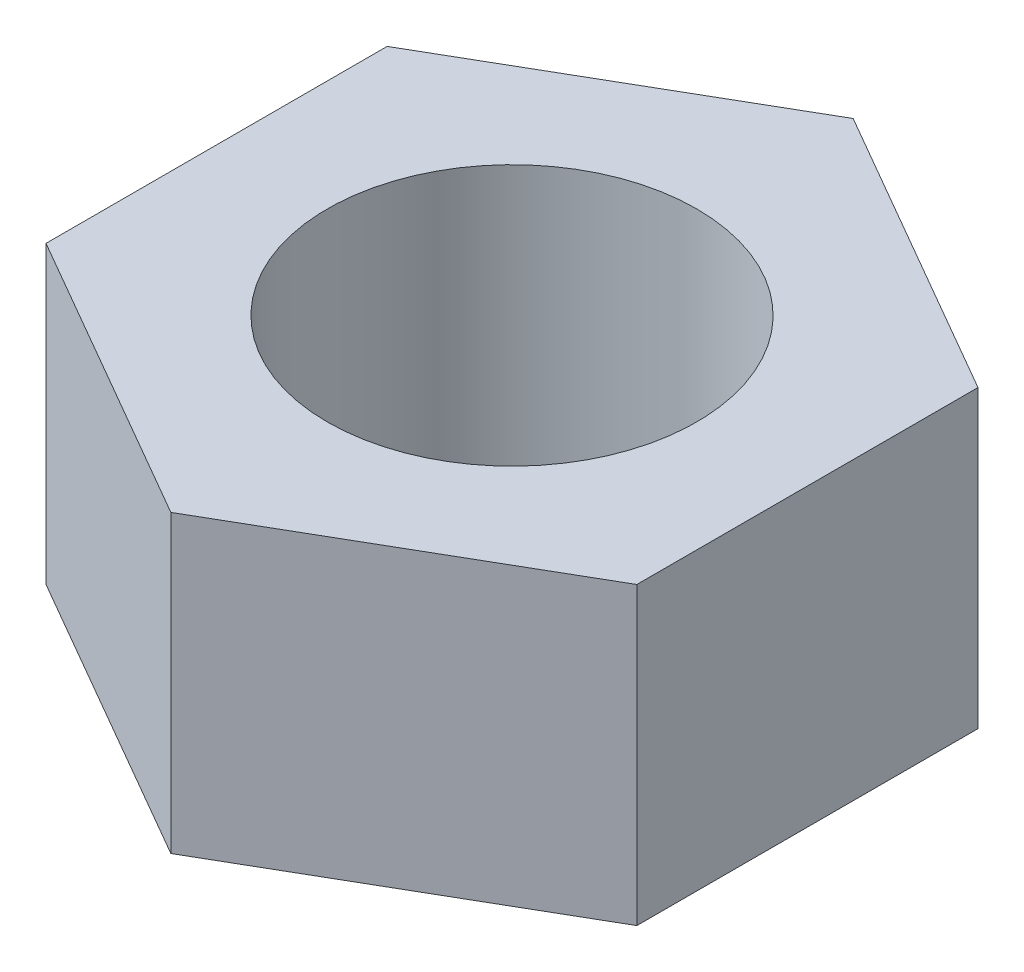
ISO-10303-21;
HEADER;
FILE_DESCRIPTION(('STEP AP214'),'2;1');
FILE_NAME('part.step','',(''),(''),'','','');
FILE_SCHEMA(('AUTOMOTIVE_DESIGN { 1 0 10303 214 1 1 1 1 }'));
ENDSEC;
DATA;
#1=APPLICATION_CONTEXT('core data for automotive mechanical design processes');
#2=APPLICATION_PROTOCOL_DEFINITION('international standard','automotive_design',2000,#1);
#3=PRODUCT_CONTEXT('',#1,'mechanical');
#4=PRODUCT('Part','Part','',(#3));
#5=PRODUCT_RELATED_PRODUCT_CATEGORY('part','',(#4));
#6=PRODUCT_DEFINITION_FORMATION('','',#4);
#7=PRODUCT_DEFINITION_CONTEXT('part definition',#1,'design');
#8=PRODUCT_DEFINITION('design','',#6,#7);
#9=PRODUCT_DEFINITION_SHAPE('','',#8);
#10=(LENGTH_UNIT() NAMED_UNIT(*) SI_UNIT(.MILLI.,.METRE.));
#11=(NAMED_UNIT(*) PLANE_ANGLE_UNIT() SI_UNIT($,.RADIAN.));
#12=(NAMED_UNIT(*) SI_UNIT($,.STERADIAN.) SOLID_ANGLE_UNIT());
#13=UNCERTAINTY_MEASURE_WITH_UNIT(LENGTH_MEASURE(1.E-05),#10,'distance_accuracy_value','');
#14=(GEOMETRIC_REPRESENTATION_CONTEXT(3) GLOBAL_UNCERTAINTY_ASSIGNED_CONTEXT((#13)) GLOBAL_UNIT_ASSIGNED_CONTEXT((#10,
#11,#12)) REPRESENTATION_CONTEXT('',''));
#15=CARTESIAN_POINT('',(0.,0.,0.));
#16=DIRECTION('',(0.,0.,1.));
#17=DIRECTION('',(1.,0.,0.));
#18=AXIS2_PLACEMENT_3D('',#15,#16,#17);
#19=CARTESIAN_POINT('',(-4.,-2.,-2.3094010767585));
#20=DIRECTION('',(-0.5,0.,-0.866025403784439));
#21=DIRECTION('',(-0.866025403784439,0.,0.5));
#22=AXIS2_PLACEMENT_3D('',#19,#20,#21);
#23=PLANE('',#22);
#24=DIRECTION('',(0.,1.,0.));
#25=VECTOR('',#24,1.);
#26=CARTESIAN_POINT('',(-4.,-2.,-2.3094010767585));
#27=LINE('',#26,#25);
#28=CARTESIAN_POINT('',(-4.,-2.,-2.3094010767585));
#29=VERTEX_POINT('',#28);
#30=CARTESIAN_POINT('',(-4.,2.,-2.3094010767585));
#31=VERTEX_POINT('',#30);
#32=EDGE_CURVE('E38',#29,#31,#27,.T.);
#33=ORIENTED_EDGE('',*,*,#32,.T.);
#34=DIRECTION('',(-0.866025403784439,0.,0.5));
#35=VECTOR('',#34,1.);
#36=CARTESIAN_POINT('',(-4.,2.,-2.3094010767585));
#37=LINE('',#36,#35);
#38=CARTESIAN_POINT('',(0.,2.,-4.61880215351701));
#39=VERTEX_POINT('',#38);
#40=EDGE_CURVE('E87',#39,#31,#37,.T.);
#41=ORIENTED_EDGE('',*,*,#40,.F.);
#42=DIRECTION('',(0.,1.,0.));
#43=VECTOR('',#42,1.);
#44=CARTESIAN_POINT('',(0.,-2.,-4.61880215351701));
#45=LINE('',#44,#43);
#46=CARTESIAN_POINT('',(0.,-2.,-4.61880215351701));
#47=VERTEX_POINT('',#46);
#48=EDGE_CURVE('E11',#47,#39,#45,.T.);
#49=ORIENTED_EDGE('',*,*,#48,.F.);
#50=DIRECTION('',(-0.866025403784439,0.,0.5));
#51=VECTOR('',#50,1.);
#52=CARTESIAN_POINT('',(-4.,-2.,-2.3094010767585));
#53=LINE('',#52,#51);
#54=EDGE_CURVE('E88',#47,#29,#53,.T.);
#55=ORIENTED_EDGE('',*,*,#54,.T.);
#56=EDGE_LOOP('',(#33,#41,#49,#55));
#57=FACE_BOUND('',#56,.T.);
#58=ADVANCED_FACE('F35',(#57),#23,.T.);
#59=CARTESIAN_POINT('',(0.,-2.,-4.61880215351701));
#60=DIRECTION('',(0.5,0.,-0.866025403784439));
#61=DIRECTION('',(-0.866025403784439,0.,-0.5));
#62=AXIS2_PLACEMENT_3D('',#59,#60,#61);
#63=PLANE('',#62);
#64=ORIENTED_EDGE('',*,*,#48,.T.);
#65=DIRECTION('',(-0.866025403784439,0.,-0.5));
#66=VECTOR('',#65,1.);
#67=CARTESIAN_POINT('',(0.,2.,-4.61880215351701));
#68=LINE('',#67,#66);
#69=CARTESIAN_POINT('',(4.,2.,-2.3094010767585));
#70=VERTEX_POINT('',#69);
#71=EDGE_CURVE('E106',#70,#39,#68,.T.);
#72=ORIENTED_EDGE('',*,*,#71,.F.);
#73=DIRECTION('',(0.,1.,0.));
#74=VECTOR('',#73,1.);
#75=CARTESIAN_POINT('',(4.,-2.,-2.3094010767585));
#76=LINE('',#75,#74);
#77=CARTESIAN_POINT('',(4.,-2.,-2.3094010767585));
#78=VERTEX_POINT('',#77);
#79=EDGE_CURVE('E43',#78,#70,#76,.T.);
#80=ORIENTED_EDGE('',*,*,#79,.F.);
#81=DIRECTION('',(-0.866025403784439,0.,-0.5));
#82=VECTOR('',#81,1.);
#83=CARTESIAN_POINT('',(0.,-2.,-4.61880215351701));
#84=LINE('',#83,#82);
#85=EDGE_CURVE('E93',#78,#47,#84,.T.);
#86=ORIENTED_EDGE('',*,*,#85,.T.);
#87=EDGE_LOOP('',(#64,#72,#80,#86));
#88=FACE_BOUND('',#87,.T.);
#89=ADVANCED_FACE('F152',(#88),#63,.T.);
#90=CARTESIAN_POINT('',(4.,-2.,-2.3094010767585));
#91=DIRECTION('',(1.,0.,0.));
#92=DIRECTION('',(0.,0.,-1.));
#93=AXIS2_PLACEMENT_3D('',#90,#91,#92);
#94=PLANE('',#93);
#95=ORIENTED_EDGE('',*,*,#79,.T.);
#96=DIRECTION('',(0.,0.,-1.));
#97=VECTOR('',#96,1.);
#98=CARTESIAN_POINT('',(4.,2.,-2.3094010767585));
#99=LINE('',#98,#97);
#100=CARTESIAN_POINT('',(4.,2.,2.3094010767585));
#101=VERTEX_POINT('',#100);
#102=EDGE_CURVE('E116',#101,#70,#99,.T.);
#103=ORIENTED_EDGE('',*,*,#102,.F.);
#104=DIRECTION('',(0.,1.,0.));
#105=VECTOR('',#104,1.);
#106=CARTESIAN_POINT('',(4.,-2.,2.3094010767585));
#107=LINE('',#106,#105);
#108=CARTESIAN_POINT('',(4.,-2.,2.3094010767585));
#109=VERTEX_POINT('',#108);
#110=EDGE_CURVE('E135',#109,#101,#107,.T.);
#111=ORIENTED_EDGE('',*,*,#110,.F.);
#112=DIRECTION('',(0.,0.,-1.));
#113=VECTOR('',#112,1.);
#114=CARTESIAN_POINT('',(4.,-2.,-2.3094010767585));
#115=LINE('',#114,#113);
#116=EDGE_CURVE('E131',#109,#78,#115,.T.);
#117=ORIENTED_EDGE('',*,*,#116,.T.);
#118=EDGE_LOOP('',(#95,#103,#111,#117));
#119=FACE_BOUND('',#118,.T.);
#120=ADVANCED_FACE('F148',(#119),#94,.T.);
#121=CARTESIAN_POINT('',(4.,-2.,2.3094010767585));
#122=DIRECTION('',(0.5,0.,0.866025403784439));
#123=DIRECTION('',(0.866025403784439,0.,-0.5));
#124=AXIS2_PLACEMENT_3D('',#121,#122,#123);
#125=PLANE('',#124);
#126=ORIENTED_EDGE('',*,*,#110,.T.);
#127=DIRECTION('',(0.866025403784439,0.,-0.5));
#128=VECTOR('',#127,1.);
#129=CARTESIAN_POINT('',(4.,2.,2.3094010767585));
#130=LINE('',#129,#128);
#131=CARTESIAN_POINT('',(0.,2.,4.61880215351701));
#132=VERTEX_POINT('',#131);
#133=EDGE_CURVE('E113',#132,#101,#130,.T.);
#134=ORIENTED_EDGE('',*,*,#133,.F.);
#135=DIRECTION('',(0.,1.,0.));
#136=VECTOR('',#135,1.);
#137=CARTESIAN_POINT('',(0.,-2.,4.61880215351701));
#138=LINE('',#137,#136);
#139=CARTESIAN_POINT('',(0.,-2.,4.61880215351701));
#140=VERTEX_POINT('',#139);
#141=EDGE_CURVE('E137',#140,#132,#138,.T.);
#142=ORIENTED_EDGE('',*,*,#141,.F.);
#143=DIRECTION('',(0.866025403784439,0.,-0.5));
#144=VECTOR('',#143,1.);
#145=CARTESIAN_POINT('',(4.,-2.,2.3094010767585));
#146=LINE('',#145,#144);
#147=EDGE_CURVE('E128',#140,#109,#146,.T.);
#148=ORIENTED_EDGE('',*,*,#147,.T.);
#149=EDGE_LOOP('',(#126,#134,#142,#148));
#150=FACE_BOUND('',#149,.T.);
#151=ADVANCED_FACE('F145',(#150),#125,.T.);
#152=CARTESIAN_POINT('',(-4.,-2.,2.3094010767585));
#153=DIRECTION('',(-0.5,0.,0.866025403784439));
#154=DIRECTION('',(0.866025403784439,0.,0.5));
#155=AXIS2_PLACEMENT_3D('',#152,#153,#154);
#156=PLANE('',#155);
#157=ORIENTED_EDGE('',*,*,#141,.T.);
#158=DIRECTION('',(0.866025403784438,0.,0.5));
#159=VECTOR('',#158,1.);
#160=CARTESIAN_POINT('',(-4.,2.,2.3094010767585));
#161=LINE('',#160,#159);
#162=CARTESIAN_POINT('',(-4.,2.,2.3094010767585));
#163=VERTEX_POINT('',#162);
#164=EDGE_CURVE('E100',#163,#132,#161,.T.);
#165=ORIENTED_EDGE('',*,*,#164,.F.);
#166=DIRECTION('',(0.,1.,0.));
#167=VECTOR('',#166,1.);
#168=CARTESIAN_POINT('',(-4.,-2.,2.3094010767585));
#169=LINE('',#168,#167);
#170=CARTESIAN_POINT('',(-4.,-2.,2.3094010767585));
#171=VERTEX_POINT('',#170);
#172=EDGE_CURVE('E92',#171,#163,#169,.T.);
#173=ORIENTED_EDGE('',*,*,#172,.F.);
#174=DIRECTION('',(0.866025403784438,0.,0.5));
#175=VECTOR('',#174,1.);
#176=CARTESIAN_POINT('',(-4.,-2.,2.3094010767585));
#177=LINE('',#176,#175);
#178=EDGE_CURVE('E125',#171,#140,#177,.T.);
#179=ORIENTED_EDGE('',*,*,#178,.T.);
#180=EDGE_LOOP('',(#157,#165,#173,#179));
#181=FACE_BOUND('',#180,.T.);
#182=ADVANCED_FACE('F139',(#181),#156,.T.);
#183=CARTESIAN_POINT('',(-4.,-2.,-2.3094010767585));
#184=DIRECTION('',(-1.,0.,0.));
#185=DIRECTION('',(0.,0.,1.));
#186=AXIS2_PLACEMENT_3D('',#183,#184,#185);
#187=PLANE('',#186);
#188=ORIENTED_EDGE('',*,*,#172,.T.);
#189=DIRECTION('',(0.,0.,1.));
#190=VECTOR('',#189,1.);
#191=CARTESIAN_POINT('',(-4.,2.,-2.3094010767585));
#192=LINE('',#191,#190);
#193=EDGE_CURVE('E95',#31,#163,#192,.T.);
#194=ORIENTED_EDGE('',*,*,#193,.F.);
#195=ORIENTED_EDGE('',*,*,#32,.F.);
#196=DIRECTION('',(0.,0.,1.));
#197=VECTOR('',#196,1.);
#198=CARTESIAN_POINT('',(-4.,-2.,-2.3094010767585));
#199=LINE('',#198,#197);
#200=EDGE_CURVE('E123',#29,#171,#199,.T.);
#201=ORIENTED_EDGE('',*,*,#200,.T.);
#202=EDGE_LOOP('',(#188,#194,#195,#201));
#203=FACE_BOUND('',#202,.T.);
#204=ADVANCED_FACE('F96',(#203),#187,.T.);
#205=CARTESIAN_POINT('',(0.,-2.,0.));
#206=DIRECTION('',(0.,-1.,0.));
#207=DIRECTION('',(0.,0.,-1.));
#208=AXIS2_PLACEMENT_3D('',#205,#206,#207);
#209=PLANE('',#208);
#210=CARTESIAN_POINT('',(0.,-2.,0.));
#211=DIRECTION('',(0.,1.,0.));
#212=DIRECTION('',(0.,0.,1.));
#213=AXIS2_PLACEMENT_3D('',#210,#211,#212);
#214=CIRCLE('',#213,2.5);
#215=CARTESIAN_POINT('',(0.,-2.,2.5));
#216=VERTEX_POINT('',#215);
#217=EDGE_CURVE('E119',#216,#216,#214,.T.);
#218=ORIENTED_EDGE('',*,*,#217,.T.);
#219=EDGE_LOOP('',(#218));
#220=FACE_BOUND('',#219,.T.);
#221=ORIENTED_EDGE('',*,*,#54,.F.);
#222=ORIENTED_EDGE('',*,*,#85,.F.);
#223=ORIENTED_EDGE('',*,*,#116,.F.);
#224=ORIENTED_EDGE('',*,*,#147,.F.);
#225=ORIENTED_EDGE('',*,*,#178,.F.);
#226=ORIENTED_EDGE('',*,*,#200,.F.);
#227=EDGE_LOOP('',(#221,#222,#223,#224,#225,#226));
#228=FACE_BOUND('',#227,.T.);
#229=ADVANCED_FACE('F151',(#220,#228),#209,.T.);
#230=CARTESIAN_POINT('',(0.,-2.,0.));
#231=DIRECTION('',(0.,1.,0.));
#232=DIRECTION('',(0.,0.,1.));
#233=AXIS2_PLACEMENT_3D('',#230,#231,#232);
#234=CYLINDRICAL_SURFACE('',#233,2.5);
#235=ORIENTED_EDGE('',*,*,#217,.F.);
#236=EDGE_LOOP('',(#235));
#237=FACE_BOUND('',#236,.T.);
#238=CARTESIAN_POINT('',(0.,2.,0.));
#239=DIRECTION('',(0.,1.,0.));
#240=DIRECTION('',(0.,0.,1.));
#241=AXIS2_PLACEMENT_3D('',#238,#239,#240);
#242=CIRCLE('',#241,2.5);
#243=CARTESIAN_POINT('',(0.,2.,2.5));
#244=VERTEX_POINT('',#243);
#245=EDGE_CURVE('E107',#244,#244,#242,.T.);
#246=ORIENTED_EDGE('',*,*,#245,.T.);
#247=EDGE_LOOP('',(#246));
#248=FACE_BOUND('',#247,.T.);
#249=ADVANCED_FACE('F170',(#237,#248),#234,.F.);
#250=CARTESIAN_POINT('',(0.,2.,0.));
#251=DIRECTION('',(0.,-1.,0.));
#252=DIRECTION('',(0.,0.,-1.));
#253=AXIS2_PLACEMENT_3D('',#250,#251,#252);
#254=PLANE('',#253);
#255=ORIENTED_EDGE('',*,*,#40,.T.);
#256=ORIENTED_EDGE('',*,*,#193,.T.);
#257=ORIENTED_EDGE('',*,*,#164,.T.);
#258=ORIENTED_EDGE('',*,*,#133,.T.);
#259=ORIENTED_EDGE('',*,*,#102,.T.);
#260=ORIENTED_EDGE('',*,*,#71,.T.);
#261=EDGE_LOOP('',(#255,#256,#257,#258,#259,#260));
#262=FACE_BOUND('',#261,.T.);
#263=ORIENTED_EDGE('',*,*,#245,.F.);
#264=EDGE_LOOP('',(#263));
#265=FACE_BOUND('',#264,.T.);
#266=ADVANCED_FACE('F103',(#262,#265),#254,.F.);
#267=CLOSED_SHELL('',(#58,#89,#120,#151,#182,#204,#229,#249,#266));
#268=MANIFOLD_SOLID_BREP('B2',#267);
#269=ADVANCED_BREP_SHAPE_REPRESENTATION('',(#18,#268),#14);
#270=SHAPE_DEFINITION_REPRESENTATION(#9,#269);
ENDSEC;
END-ISO-10303-21;
